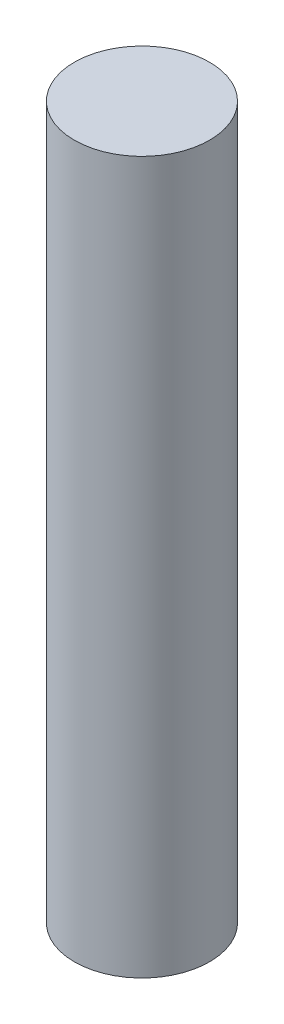
ISO-10303-21;
HEADER;
FILE_DESCRIPTION(('STEP AP214'),'2;1');
FILE_NAME('part.step','',(''),(''),'','','');
FILE_SCHEMA(('AUTOMOTIVE_DESIGN { 1 0 10303 214 1 1 1 1 }'));
ENDSEC;
DATA;
#1=APPLICATION_CONTEXT('core data for automotive mechanical design processes');
#2=APPLICATION_PROTOCOL_DEFINITION('international standard','automotive_design',2000,#1);
#3=PRODUCT_CONTEXT('',#1,'mechanical');
#4=PRODUCT('Part','Part','',(#3));
#5=PRODUCT_RELATED_PRODUCT_CATEGORY('part','',(#4));
#6=PRODUCT_DEFINITION_FORMATION('','',#4);
#7=PRODUCT_DEFINITION_CONTEXT('part definition',#1,'design');
#8=PRODUCT_DEFINITION('design','',#6,#7);
#9=PRODUCT_DEFINITION_SHAPE('','',#8);
#10=(LENGTH_UNIT() NAMED_UNIT(*) SI_UNIT(.MILLI.,.METRE.));
#11=(NAMED_UNIT(*) PLANE_ANGLE_UNIT() SI_UNIT($,.RADIAN.));
#12=(NAMED_UNIT(*) SI_UNIT($,.STERADIAN.) SOLID_ANGLE_UNIT());
#13=UNCERTAINTY_MEASURE_WITH_UNIT(LENGTH_MEASURE(1.E-05),#10,'distance_accuracy_value','');
#14=(GEOMETRIC_REPRESENTATION_CONTEXT(3) GLOBAL_UNCERTAINTY_ASSIGNED_CONTEXT((#13)) GLOBAL_UNIT_ASSIGNED_CONTEXT((#10,
#11,#12)) REPRESENTATION_CONTEXT('',''));
#15=CARTESIAN_POINT('',(0.,0.,0.));
#16=DIRECTION('',(0.,0.,1.));
#17=DIRECTION('',(1.,0.,0.));
#18=AXIS2_PLACEMENT_3D('',#15,#16,#17);
#19=CARTESIAN_POINT('',(0.,20.,0.));
#20=DIRECTION('',(0.,-1.,0.));
#21=DIRECTION('',(0.,0.,-1.));
#22=AXIS2_PLACEMENT_3D('',#19,#20,#21);
#23=CYLINDRICAL_SURFACE('',#22,1.9);
#24=CARTESIAN_POINT('',(0.,20.,0.));
#25=DIRECTION('',(0.,1.,0.));
#26=DIRECTION('',(0.,0.,1.));
#27=AXIS2_PLACEMENT_3D('',#24,#25,#26);
#28=CIRCLE('',#27,1.9);
#29=CARTESIAN_POINT('',(0.,20.,1.9));
#30=VERTEX_POINT('',#29);
#31=EDGE_CURVE('E10',#30,#30,#28,.T.);
#32=ORIENTED_EDGE('',*,*,#31,.F.);
#33=EDGE_LOOP('',(#32));
#34=FACE_BOUND('',#33,.T.);
#35=CARTESIAN_POINT('',(0.,0.,0.));
#36=DIRECTION('',(0.,1.,0.));
#37=DIRECTION('',(0.,0.,1.));
#38=AXIS2_PLACEMENT_3D('',#35,#36,#37);
#39=CIRCLE('',#38,1.9);
#40=CARTESIAN_POINT('',(0.,0.,1.9));
#41=VERTEX_POINT('',#40);
#42=EDGE_CURVE('E40',#41,#41,#39,.T.);
#43=ORIENTED_EDGE('',*,*,#42,.T.);
#44=EDGE_LOOP('',(#43));
#45=FACE_BOUND('',#44,.T.);
#46=ADVANCED_FACE('F37',(#34,#45),#23,.T.);
#47=CARTESIAN_POINT('',(0.,20.,0.));
#48=DIRECTION('',(0.,1.,0.));
#49=DIRECTION('',(0.,0.,1.));
#50=AXIS2_PLACEMENT_3D('',#47,#48,#49);
#51=PLANE('',#50);
#52=ORIENTED_EDGE('',*,*,#31,.T.);
#53=EDGE_LOOP('',(#52));
#54=FACE_BOUND('',#53,.T.);
#55=ADVANCED_FACE('F52',(#54),#51,.T.);
#56=CARTESIAN_POINT('',(0.,0.,0.));
#57=DIRECTION('',(0.,1.,0.));
#58=DIRECTION('',(0.,0.,1.));
#59=AXIS2_PLACEMENT_3D('',#56,#57,#58);
#60=PLANE('',#59);
#61=ORIENTED_EDGE('',*,*,#42,.F.);
#62=EDGE_LOOP('',(#61));
#63=FACE_BOUND('',#62,.T.);
#64=ADVANCED_FACE('F50',(#63),#60,.F.);
#65=CLOSED_SHELL('',(#46,#55,#64));
#66=MANIFOLD_SOLID_BREP('B2',#65);
#67=ADVANCED_BREP_SHAPE_REPRESENTATION('',(#18,#66),#14);
#68=SHAPE_DEFINITION_REPRESENTATION(#9,#67);
ENDSEC;
END-ISO-10303-21;
